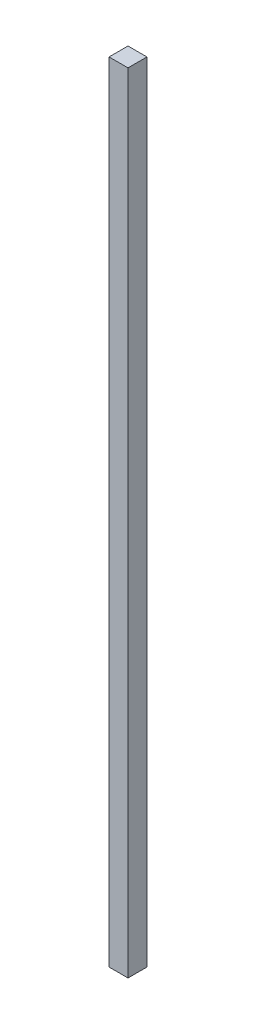
ISO-10303-21;
HEADER;
FILE_DESCRIPTION(('STEP AP214'),'2;1');
FILE_NAME('part.step','',(''),(''),'','','');
FILE_SCHEMA(('AUTOMOTIVE_DESIGN { 1 0 10303 214 1 1 1 1 }'));
ENDSEC;
DATA;
#1=APPLICATION_CONTEXT('core data for automotive mechanical design processes');
#2=APPLICATION_PROTOCOL_DEFINITION('international standard','automotive_design',2000,#1);
#3=PRODUCT_CONTEXT('',#1,'mechanical');
#4=PRODUCT('Part','Part','',(#3));
#5=PRODUCT_RELATED_PRODUCT_CATEGORY('part','',(#4));
#6=PRODUCT_DEFINITION_FORMATION('','',#4);
#7=PRODUCT_DEFINITION_CONTEXT('part definition',#1,'design');
#8=PRODUCT_DEFINITION('design','',#6,#7);
#9=PRODUCT_DEFINITION_SHAPE('','',#8);
#10=(LENGTH_UNIT() NAMED_UNIT(*) SI_UNIT(.MILLI.,.METRE.));
#11=(NAMED_UNIT(*) PLANE_ANGLE_UNIT() SI_UNIT($,.RADIAN.));
#12=(NAMED_UNIT(*) SI_UNIT($,.STERADIAN.) SOLID_ANGLE_UNIT());
#13=UNCERTAINTY_MEASURE_WITH_UNIT(LENGTH_MEASURE(1.E-05),#10,'distance_accuracy_value','');
#14=(GEOMETRIC_REPRESENTATION_CONTEXT(3) GLOBAL_UNCERTAINTY_ASSIGNED_CONTEXT((#13)) GLOBAL_UNIT_ASSIGNED_CONTEXT((#10,
#11,#12)) REPRESENTATION_CONTEXT('',''));
#15=CARTESIAN_POINT('',(0.,0.,0.));
#16=DIRECTION('',(0.,0.,1.));
#17=DIRECTION('',(1.,0.,0.));
#18=AXIS2_PLACEMENT_3D('',#15,#16,#17);
#19=CARTESIAN_POINT('',(3.,125.,-3.));
#20=DIRECTION('',(-1.,0.,0.));
#21=DIRECTION('',(0.,0.,1.));
#22=AXIS2_PLACEMENT_3D('',#19,#20,#21);
#23=PLANE('',#22);
#24=DIRECTION('',(0.,0.,-1.));
#25=VECTOR('',#24,1.);
#26=CARTESIAN_POINT('',(3.,-125.,-3.));
#27=LINE('',#26,#25);
#28=CARTESIAN_POINT('',(3.,-125.,3.));
#29=VERTEX_POINT('',#28);
#30=CARTESIAN_POINT('',(3.,-125.,-3.));
#31=VERTEX_POINT('',#30);
#32=EDGE_CURVE('E113',#29,#31,#27,.T.);
#33=ORIENTED_EDGE('',*,*,#32,.T.);
#34=DIRECTION('',(0.,-1.,0.));
#35=VECTOR('',#34,1.);
#36=CARTESIAN_POINT('',(3.,125.,-3.));
#37=LINE('',#36,#35);
#38=CARTESIAN_POINT('',(3.,125.,-3.));
#39=VERTEX_POINT('',#38);
#40=EDGE_CURVE('E11',#39,#31,#37,.T.);
#41=ORIENTED_EDGE('',*,*,#40,.F.);
#42=DIRECTION('',(0.,0.,-1.));
#43=VECTOR('',#42,1.);
#44=CARTESIAN_POINT('',(3.,125.,-3.));
#45=LINE('',#44,#43);
#46=CARTESIAN_POINT('',(3.,125.,3.));
#47=VERTEX_POINT('',#46);
#48=EDGE_CURVE('E97',#47,#39,#45,.T.);
#49=ORIENTED_EDGE('',*,*,#48,.F.);
#50=DIRECTION('',(0.,-1.,0.));
#51=VECTOR('',#50,1.);
#52=CARTESIAN_POINT('',(3.,125.,3.));
#53=LINE('',#52,#51);
#54=EDGE_CURVE('E109',#47,#29,#53,.T.);
#55=ORIENTED_EDGE('',*,*,#54,.T.);
#56=EDGE_LOOP('',(#33,#41,#49,#55));
#57=FACE_BOUND('',#56,.T.);
#58=ADVANCED_FACE('F45',(#57),#23,.F.);
#59=CARTESIAN_POINT('',(-3.,125.,-3.));
#60=DIRECTION('',(0.,0.,1.));
#61=DIRECTION('',(1.,0.,0.));
#62=AXIS2_PLACEMENT_3D('',#59,#60,#61);
#63=PLANE('',#62);
#64=DIRECTION('',(-1.,0.,0.));
#65=VECTOR('',#64,1.);
#66=CARTESIAN_POINT('',(-3.,-125.,-3.));
#67=LINE('',#66,#65);
#68=CARTESIAN_POINT('',(-3.,-125.,-3.));
#69=VERTEX_POINT('',#68);
#70=EDGE_CURVE('E102',#31,#69,#67,.T.);
#71=ORIENTED_EDGE('',*,*,#70,.T.);
#72=DIRECTION('',(0.,-1.,0.));
#73=VECTOR('',#72,1.);
#74=CARTESIAN_POINT('',(-3.,125.,-3.));
#75=LINE('',#74,#73);
#76=CARTESIAN_POINT('',(-3.,125.,-3.));
#77=VERTEX_POINT('',#76);
#78=EDGE_CURVE('E54',#77,#69,#75,.T.);
#79=ORIENTED_EDGE('',*,*,#78,.F.);
#80=DIRECTION('',(-1.,0.,0.));
#81=VECTOR('',#80,1.);
#82=CARTESIAN_POINT('',(-3.,125.,-3.));
#83=LINE('',#82,#81);
#84=EDGE_CURVE('E92',#39,#77,#83,.T.);
#85=ORIENTED_EDGE('',*,*,#84,.F.);
#86=ORIENTED_EDGE('',*,*,#40,.T.);
#87=EDGE_LOOP('',(#71,#79,#85,#86));
#88=FACE_BOUND('',#87,.T.);
#89=ADVANCED_FACE('F101',(#88),#63,.F.);
#90=CARTESIAN_POINT('',(-3.,125.,-3.));
#91=DIRECTION('',(1.,0.,0.));
#92=DIRECTION('',(0.,0.,-1.));
#93=AXIS2_PLACEMENT_3D('',#90,#91,#92);
#94=PLANE('',#93);
#95=DIRECTION('',(0.,0.,1.));
#96=VECTOR('',#95,1.);
#97=CARTESIAN_POINT('',(-3.,-125.,-3.));
#98=LINE('',#97,#96);
#99=CARTESIAN_POINT('',(-3.,-125.,3.));
#100=VERTEX_POINT('',#99);
#101=EDGE_CURVE('E79',#69,#100,#98,.T.);
#102=ORIENTED_EDGE('',*,*,#101,.T.);
#103=DIRECTION('',(0.,-1.,0.));
#104=VECTOR('',#103,1.);
#105=CARTESIAN_POINT('',(-3.,125.,3.));
#106=LINE('',#105,#104);
#107=CARTESIAN_POINT('',(-3.,125.,3.));
#108=VERTEX_POINT('',#107);
#109=EDGE_CURVE('E104',#108,#100,#106,.T.);
#110=ORIENTED_EDGE('',*,*,#109,.F.);
#111=DIRECTION('',(0.,0.,1.));
#112=VECTOR('',#111,1.);
#113=CARTESIAN_POINT('',(-3.,125.,-3.));
#114=LINE('',#113,#112);
#115=EDGE_CURVE('E95',#77,#108,#114,.T.);
#116=ORIENTED_EDGE('',*,*,#115,.F.);
#117=ORIENTED_EDGE('',*,*,#78,.T.);
#118=EDGE_LOOP('',(#102,#110,#116,#117));
#119=FACE_BOUND('',#118,.T.);
#120=ADVANCED_FACE('F105',(#119),#94,.F.);
#121=CARTESIAN_POINT('',(-3.,125.,3.));
#122=DIRECTION('',(0.,0.,-1.));
#123=DIRECTION('',(-1.,0.,0.));
#124=AXIS2_PLACEMENT_3D('',#121,#122,#123);
#125=PLANE('',#124);
#126=DIRECTION('',(1.,0.,0.));
#127=VECTOR('',#126,1.);
#128=CARTESIAN_POINT('',(-3.,-125.,3.));
#129=LINE('',#128,#127);
#130=EDGE_CURVE('E85',#100,#29,#129,.T.);
#131=ORIENTED_EDGE('',*,*,#130,.T.);
#132=ORIENTED_EDGE('',*,*,#54,.F.);
#133=DIRECTION('',(1.,0.,0.));
#134=VECTOR('',#133,1.);
#135=CARTESIAN_POINT('',(-3.,125.,3.));
#136=LINE('',#135,#134);
#137=EDGE_CURVE('E62',#108,#47,#136,.T.);
#138=ORIENTED_EDGE('',*,*,#137,.F.);
#139=ORIENTED_EDGE('',*,*,#109,.T.);
#140=EDGE_LOOP('',(#131,#132,#138,#139));
#141=FACE_BOUND('',#140,.T.);
#142=ADVANCED_FACE('F126',(#141),#125,.F.);
#143=CARTESIAN_POINT('',(0.,125.,0.));
#144=DIRECTION('',(0.,1.,0.));
#145=DIRECTION('',(0.,0.,1.));
#146=AXIS2_PLACEMENT_3D('',#143,#144,#145);
#147=PLANE('',#146);
#148=ORIENTED_EDGE('',*,*,#48,.T.);
#149=ORIENTED_EDGE('',*,*,#84,.T.);
#150=ORIENTED_EDGE('',*,*,#115,.T.);
#151=ORIENTED_EDGE('',*,*,#137,.T.);
#152=EDGE_LOOP('',(#148,#149,#150,#151));
#153=FACE_BOUND('',#152,.T.);
#154=ADVANCED_FACE('F93',(#153),#147,.T.);
#155=CARTESIAN_POINT('',(0.,-125.,0.));
#156=DIRECTION('',(0.,1.,0.));
#157=DIRECTION('',(0.,0.,1.));
#158=AXIS2_PLACEMENT_3D('',#155,#156,#157);
#159=PLANE('',#158);
#160=ORIENTED_EDGE('',*,*,#32,.F.);
#161=ORIENTED_EDGE('',*,*,#130,.F.);
#162=ORIENTED_EDGE('',*,*,#101,.F.);
#163=ORIENTED_EDGE('',*,*,#70,.F.);
#164=EDGE_LOOP('',(#160,#161,#162,#163));
#165=FACE_BOUND('',#164,.T.);
#166=ADVANCED_FACE('F129',(#165),#159,.F.);
#167=CLOSED_SHELL('',(#58,#89,#120,#142,#154,#166));
#168=MANIFOLD_SOLID_BREP('B2',#167);
#169=ADVANCED_BREP_SHAPE_REPRESENTATION('',(#18,#168),#14);
#170=SHAPE_DEFINITION_REPRESENTATION(#9,#169);
ENDSEC;
END-ISO-10303-21;
